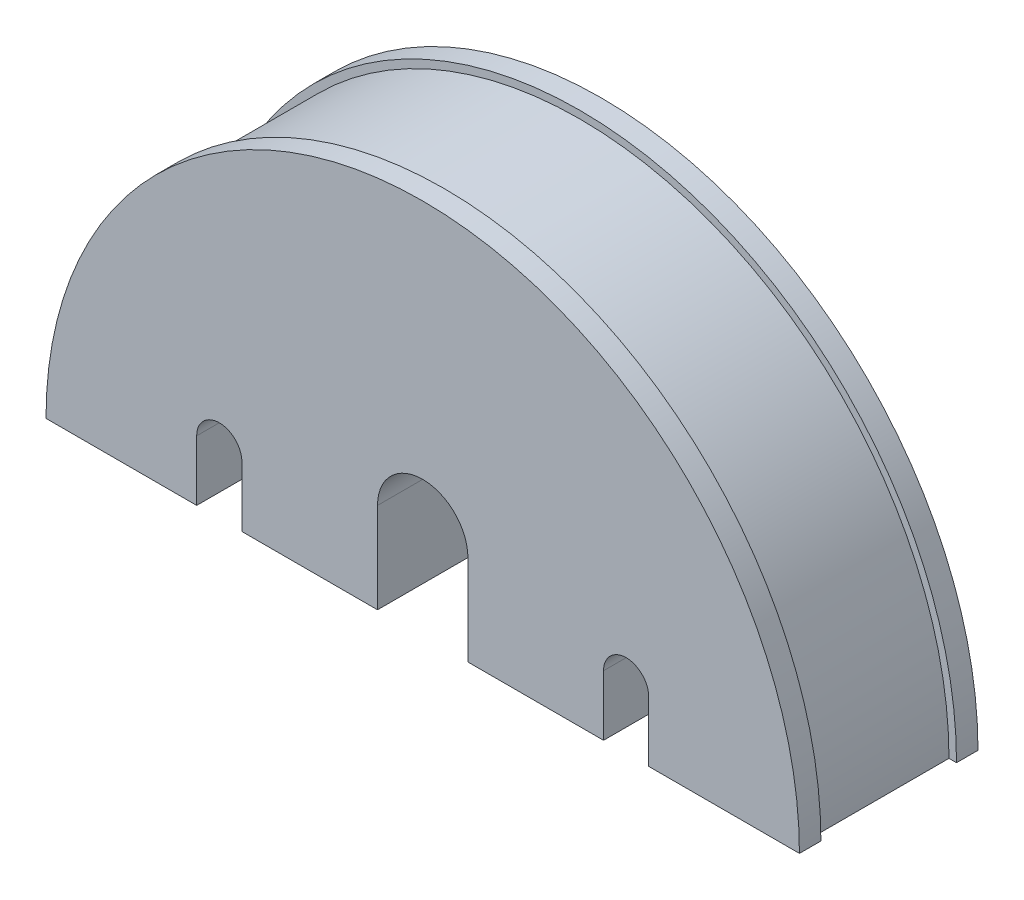
ISO-10303-21;
HEADER;
FILE_DESCRIPTION(('STEP AP214'),'2;1');
FILE_NAME('part.step','',(''),(''),'','','');
FILE_SCHEMA(('AUTOMOTIVE_DESIGN { 1 0 10303 214 1 1 1 1 }'));
ENDSEC;
DATA;
#1=APPLICATION_CONTEXT('core data for automotive mechanical design processes');
#2=APPLICATION_PROTOCOL_DEFINITION('international standard','automotive_design',2000,#1);
#3=PRODUCT_CONTEXT('',#1,'mechanical');
#4=PRODUCT('Part','Part','',(#3));
#5=PRODUCT_RELATED_PRODUCT_CATEGORY('part','',(#4));
#6=PRODUCT_DEFINITION_FORMATION('','',#4);
#7=PRODUCT_DEFINITION_CONTEXT('part definition',#1,'design');
#8=PRODUCT_DEFINITION('design','',#6,#7);
#9=PRODUCT_DEFINITION_SHAPE('','',#8);
#10=(LENGTH_UNIT() NAMED_UNIT(*) SI_UNIT(.MILLI.,.METRE.));
#11=(NAMED_UNIT(*) PLANE_ANGLE_UNIT() SI_UNIT($,.RADIAN.));
#12=(NAMED_UNIT(*) SI_UNIT($,.STERADIAN.) SOLID_ANGLE_UNIT());
#13=UNCERTAINTY_MEASURE_WITH_UNIT(LENGTH_MEASURE(1.E-05),#10,'distance_accuracy_value','');
#14=(GEOMETRIC_REPRESENTATION_CONTEXT(3) GLOBAL_UNCERTAINTY_ASSIGNED_CONTEXT((#13)) GLOBAL_UNIT_ASSIGNED_CONTEXT((#10,
#11,#12)) REPRESENTATION_CONTEXT('',''));
#15=CARTESIAN_POINT('',(0.,0.,0.));
#16=DIRECTION('',(0.,0.,1.));
#17=DIRECTION('',(1.,0.,0.));
#18=AXIS2_PLACEMENT_3D('',#15,#16,#17);
#19=CARTESIAN_POINT('',(0.,0.,118.5));
#20=DIRECTION('',(0.,0.,-1.));
#21=DIRECTION('',(-1.,0.,0.));
#22=AXIS2_PLACEMENT_3D('',#19,#20,#21);
#23=CYLINDRICAL_SURFACE('',#22,500.);
#24=CARTESIAN_POINT('',(0.,0.,-89.9999999999999));
#25=DIRECTION('',(0.,0.,1.));
#26=DIRECTION('',(1.,0.,0.));
#27=AXIS2_PLACEMENT_3D('',#24,#25,#26);
#28=CIRCLE('',#27,500.);
#29=CARTESIAN_POINT('',(500.,0.,-89.9999999999999));
#30=VERTEX_POINT('',#29);
#31=CARTESIAN_POINT('',(-500.,-3.49148133884313E-12,-89.9999999999999));
#32=VERTEX_POINT('',#31);
#33=EDGE_CURVE('E193',#30,#32,#28,.T.);
#34=ORIENTED_EDGE('',*,*,#33,.F.);
#35=DIRECTION('',(0.,0.,-1.));
#36=VECTOR('',#35,1.);
#37=CARTESIAN_POINT('',(500.,0.,118.5));
#38=LINE('',#37,#36);
#39=CARTESIAN_POINT('',(500.,0.,-118.5));
#40=VERTEX_POINT('',#39);
#41=EDGE_CURVE('E115',#30,#40,#38,.T.);
#42=ORIENTED_EDGE('',*,*,#41,.T.);
#43=CARTESIAN_POINT('',(0.,0.,-118.5));
#44=DIRECTION('',(0.,0.,1.));
#45=DIRECTION('',(1.,0.,0.));
#46=AXIS2_PLACEMENT_3D('',#43,#44,#45);
#47=CIRCLE('',#46,500.);
#48=CARTESIAN_POINT('',(-500.,0.,-118.5));
#49=VERTEX_POINT('',#48);
#50=EDGE_CURVE('E189',#40,#49,#47,.T.);
#51=ORIENTED_EDGE('',*,*,#50,.T.);
#52=DIRECTION('',(0.,0.,-1.));
#53=VECTOR('',#52,1.);
#54=CARTESIAN_POINT('',(-500.,0.,118.5));
#55=LINE('',#54,#53);
#56=EDGE_CURVE('E275',#32,#49,#55,.T.);
#57=ORIENTED_EDGE('',*,*,#56,.F.);
#58=EDGE_LOOP('',(#34,#42,#51,#57));
#59=FACE_BOUND('',#58,.T.);
#60=ADVANCED_FACE('F39',(#59),#23,.T.);
#61=CARTESIAN_POINT('',(0.,0.,90.0000000000001));
#62=DIRECTION('',(0.,0.,-1.));
#63=DIRECTION('',(-1.,0.,0.));
#64=AXIS2_PLACEMENT_3D('',#61,#62,#63);
#65=CIRCLE('',#64,500.);
#66=CARTESIAN_POINT('',(-500.,-3.49148133884313E-12,90.0000000000001));
#67=VERTEX_POINT('',#66);
#68=CARTESIAN_POINT('',(500.,0.,90.0000000000001));
#69=VERTEX_POINT('',#68);
#70=EDGE_CURVE('E54',#67,#69,#65,.T.);
#71=ORIENTED_EDGE('',*,*,#70,.F.);
#72=CARTESIAN_POINT('',(-500.,0.,118.5));
#73=VERTEX_POINT('',#72);
#74=EDGE_CURVE('E47',#73,#67,#55,.T.);
#75=ORIENTED_EDGE('',*,*,#74,.F.);
#76=CARTESIAN_POINT('',(0.,0.,118.5));
#77=DIRECTION('',(0.,0.,1.));
#78=DIRECTION('',(1.,0.,0.));
#79=AXIS2_PLACEMENT_3D('',#76,#77,#78);
#80=CIRCLE('',#79,500.);
#81=CARTESIAN_POINT('',(500.,0.,118.5));
#82=VERTEX_POINT('',#81);
#83=EDGE_CURVE('E231',#82,#73,#80,.T.);
#84=ORIENTED_EDGE('',*,*,#83,.F.);
#85=EDGE_CURVE('E232',#82,#69,#38,.T.);
#86=ORIENTED_EDGE('',*,*,#85,.T.);
#87=EDGE_LOOP('',(#71,#75,#84,#86));
#88=FACE_BOUND('',#87,.T.);
#89=ADVANCED_FACE('F297',(#88),#23,.T.);
#90=CARTESIAN_POINT('',(-500.,0.,118.5));
#91=DIRECTION('',(0.,1.,0.));
#92=DIRECTION('',(0.,0.,1.));
#93=AXIS2_PLACEMENT_3D('',#90,#91,#92);
#94=PLANE('',#93);
#95=DIRECTION('',(1.,0.,0.));
#96=VECTOR('',#95,1.);
#97=CARTESIAN_POINT('',(-490.000000000004,-3.4216517120663E-12,-89.9999999999999));
#98=LINE('',#97,#96);
#99=CARTESIAN_POINT('',(-490.000000000004,-3.4216517120663E-12,-89.9999999999999));
#100=VERTEX_POINT('',#99);
#101=EDGE_CURVE('E288',#32,#100,#98,.T.);
#102=ORIENTED_EDGE('',*,*,#101,.F.);
#103=ORIENTED_EDGE('',*,*,#56,.T.);
#104=DIRECTION('',(1.,0.,0.));
#105=VECTOR('',#104,1.);
#106=CARTESIAN_POINT('',(-500.,0.,-118.5));
#107=LINE('',#106,#105);
#108=CARTESIAN_POINT('',(-300.,0.,-118.5));
#109=VERTEX_POINT('',#108);
#110=EDGE_CURVE('E192',#49,#109,#107,.T.);
#111=ORIENTED_EDGE('',*,*,#110,.T.);
#112=DIRECTION('',(0.,0.,-1.));
#113=VECTOR('',#112,1.);
#114=CARTESIAN_POINT('',(-300.,0.,118.5));
#115=LINE('',#114,#113);
#116=CARTESIAN_POINT('',(-300.,0.,118.5));
#117=VERTEX_POINT('',#116);
#118=EDGE_CURVE('E272',#117,#109,#115,.T.);
#119=ORIENTED_EDGE('',*,*,#118,.F.);
#120=DIRECTION('',(1.,0.,0.));
#121=VECTOR('',#120,1.);
#122=CARTESIAN_POINT('',(-500.,0.,118.5));
#123=LINE('',#122,#121);
#124=EDGE_CURVE('E124',#73,#117,#123,.T.);
#125=ORIENTED_EDGE('',*,*,#124,.F.);
#126=ORIENTED_EDGE('',*,*,#74,.T.);
#127=DIRECTION('',(-1.,0.,0.));
#128=VECTOR('',#127,1.);
#129=CARTESIAN_POINT('',(-490.000000000003,-3.4216517120663E-12,90.0000000000001));
#130=LINE('',#129,#128);
#131=CARTESIAN_POINT('',(-490.000000000003,-3.4216517120663E-12,90.0000000000001));
#132=VERTEX_POINT('',#131);
#133=EDGE_CURVE('E560',#132,#67,#130,.T.);
#134=ORIENTED_EDGE('',*,*,#133,.F.);
#135=DIRECTION('',(0.,0.,1.));
#136=VECTOR('',#135,1.);
#137=CARTESIAN_POINT('',(-490.000000000004,-3.4216517120663E-12,-89.9999999999999));
#138=LINE('',#137,#136);
#139=EDGE_CURVE('E556',#100,#132,#138,.T.);
#140=ORIENTED_EDGE('',*,*,#139,.F.);
#141=EDGE_LOOP('',(#102,#103,#111,#119,#125,#126,#134,#140));
#142=FACE_BOUND('',#141,.T.);
#143=ADVANCED_FACE('F284',(#142),#94,.F.);
#144=CARTESIAN_POINT('',(300.,0.,118.5));
#145=DIRECTION('',(0.,1.,0.));
#146=DIRECTION('',(0.,0.,1.));
#147=AXIS2_PLACEMENT_3D('',#144,#145,#146);
#148=PLANE('',#147);
#149=DIRECTION('',(1.,0.,0.));
#150=VECTOR('',#149,1.);
#151=CARTESIAN_POINT('',(300.,0.,-89.9999999999999));
#152=LINE('',#151,#150);
#153=CARTESIAN_POINT('',(490.000000000004,0.,-89.9999999999999));
#154=VERTEX_POINT('',#153);
#155=EDGE_CURVE('E11',#154,#30,#152,.T.);
#156=ORIENTED_EDGE('',*,*,#155,.F.);
#157=DIRECTION('',(0.,0.,1.));
#158=VECTOR('',#157,1.);
#159=CARTESIAN_POINT('',(490.000000000004,0.,-89.9999999999999));
#160=LINE('',#159,#158);
#161=CARTESIAN_POINT('',(490.000000000003,0.,90.0000000000001));
#162=VERTEX_POINT('',#161);
#163=EDGE_CURVE('E555',#154,#162,#160,.T.);
#164=ORIENTED_EDGE('',*,*,#163,.T.);
#165=DIRECTION('',(1.,0.,0.));
#166=VECTOR('',#165,1.);
#167=CARTESIAN_POINT('',(490.000000000003,0.,90.0000000000001));
#168=LINE('',#167,#166);
#169=EDGE_CURVE('E361',#162,#69,#168,.T.);
#170=ORIENTED_EDGE('',*,*,#169,.T.);
#171=ORIENTED_EDGE('',*,*,#85,.F.);
#172=DIRECTION('',(1.,0.,0.));
#173=VECTOR('',#172,1.);
#174=CARTESIAN_POINT('',(300.,0.,118.5));
#175=LINE('',#174,#173);
#176=CARTESIAN_POINT('',(300.,0.,118.5));
#177=VERTEX_POINT('',#176);
#178=EDGE_CURVE('E63',#177,#82,#175,.T.);
#179=ORIENTED_EDGE('',*,*,#178,.F.);
#180=DIRECTION('',(0.,0.,-1.));
#181=VECTOR('',#180,1.);
#182=CARTESIAN_POINT('',(300.,0.,118.5));
#183=LINE('',#182,#181);
#184=CARTESIAN_POINT('',(300.,0.,-118.5));
#185=VERTEX_POINT('',#184);
#186=EDGE_CURVE('E179',#177,#185,#183,.T.);
#187=ORIENTED_EDGE('',*,*,#186,.T.);
#188=DIRECTION('',(1.,0.,0.));
#189=VECTOR('',#188,1.);
#190=CARTESIAN_POINT('',(300.,0.,-118.5));
#191=LINE('',#190,#189);
#192=EDGE_CURVE('E228',#185,#40,#191,.T.);
#193=ORIENTED_EDGE('',*,*,#192,.T.);
#194=ORIENTED_EDGE('',*,*,#41,.F.);
#195=EDGE_LOOP('',(#156,#164,#170,#171,#179,#187,#193,#194));
#196=FACE_BOUND('',#195,.T.);
#197=ADVANCED_FACE('F305',(#196),#148,.F.);
#198=CARTESIAN_POINT('',(-300.,80.,118.5));
#199=DIRECTION('',(-1.,0.,0.));
#200=DIRECTION('',(0.,-1.,0.));
#201=AXIS2_PLACEMENT_3D('',#198,#199,#200);
#202=PLANE('',#201);
#203=DIRECTION('',(0.,1.,0.));
#204=VECTOR('',#203,1.);
#205=CARTESIAN_POINT('',(-300.,80.,-118.5));
#206=LINE('',#205,#204);
#207=CARTESIAN_POINT('',(-300.,80.,-118.5));
#208=VERTEX_POINT('',#207);
#209=EDGE_CURVE('E196',#109,#208,#206,.T.);
#210=ORIENTED_EDGE('',*,*,#209,.T.);
#211=DIRECTION('',(0.,0.,-1.));
#212=VECTOR('',#211,1.);
#213=CARTESIAN_POINT('',(-300.,80.,118.5));
#214=LINE('',#213,#212);
#215=CARTESIAN_POINT('',(-300.,80.,118.5));
#216=VERTEX_POINT('',#215);
#217=EDGE_CURVE('E268',#216,#208,#214,.T.);
#218=ORIENTED_EDGE('',*,*,#217,.F.);
#219=DIRECTION('',(0.,1.,0.));
#220=VECTOR('',#219,1.);
#221=CARTESIAN_POINT('',(-300.,80.,118.5));
#222=LINE('',#221,#220);
#223=EDGE_CURVE('E324',#117,#216,#222,.T.);
#224=ORIENTED_EDGE('',*,*,#223,.F.);
#225=ORIENTED_EDGE('',*,*,#118,.T.);
#226=EDGE_LOOP('',(#210,#218,#224,#225));
#227=FACE_BOUND('',#226,.T.);
#228=ADVANCED_FACE('F365',(#227),#202,.F.);
#229=CARTESIAN_POINT('',(-270.,80.,118.5));
#230=DIRECTION('',(0.,0.,-1.));
#231=DIRECTION('',(-1.,0.,0.));
#232=AXIS2_PLACEMENT_3D('',#229,#230,#231);
#233=CYLINDRICAL_SURFACE('',#232,30.);
#234=CARTESIAN_POINT('',(-270.,80.,-118.5));
#235=DIRECTION('',(0.,0.,-1.));
#236=DIRECTION('',(1.,0.,0.));
#237=AXIS2_PLACEMENT_3D('',#234,#235,#236);
#238=CIRCLE('',#237,30.);
#239=CARTESIAN_POINT('',(-240.,80.,-118.5));
#240=VERTEX_POINT('',#239);
#241=EDGE_CURVE('E199',#208,#240,#238,.T.);
#242=ORIENTED_EDGE('',*,*,#241,.T.);
#243=DIRECTION('',(0.,0.,-1.));
#244=VECTOR('',#243,1.);
#245=CARTESIAN_POINT('',(-240.,80.,118.5));
#246=LINE('',#245,#244);
#247=CARTESIAN_POINT('',(-240.,80.,118.5));
#248=VERTEX_POINT('',#247);
#249=EDGE_CURVE('E264',#248,#240,#246,.T.);
#250=ORIENTED_EDGE('',*,*,#249,.F.);
#251=CARTESIAN_POINT('',(-270.,80.,118.5));
#252=DIRECTION('',(0.,0.,-1.));
#253=DIRECTION('',(1.,0.,0.));
#254=AXIS2_PLACEMENT_3D('',#251,#252,#253);
#255=CIRCLE('',#254,30.);
#256=EDGE_CURVE('E327',#216,#248,#255,.T.);
#257=ORIENTED_EDGE('',*,*,#256,.F.);
#258=ORIENTED_EDGE('',*,*,#217,.T.);
#259=EDGE_LOOP('',(#242,#250,#257,#258));
#260=FACE_BOUND('',#259,.T.);
#261=ADVANCED_FACE('F369',(#260),#233,.F.);
#262=CARTESIAN_POINT('',(-240.,80.,118.5));
#263=DIRECTION('',(1.,0.,0.));
#264=DIRECTION('',(0.,0.,-1.));
#265=AXIS2_PLACEMENT_3D('',#262,#263,#264);
#266=PLANE('',#265);
#267=DIRECTION('',(0.,-1.,0.));
#268=VECTOR('',#267,1.);
#269=CARTESIAN_POINT('',(-240.,80.,-118.5));
#270=LINE('',#269,#268);
#271=CARTESIAN_POINT('',(-240.,0.,-118.5));
#272=VERTEX_POINT('',#271);
#273=EDGE_CURVE('E202',#240,#272,#270,.T.);
#274=ORIENTED_EDGE('',*,*,#273,.T.);
#275=DIRECTION('',(0.,0.,-1.));
#276=VECTOR('',#275,1.);
#277=CARTESIAN_POINT('',(-240.,0.,118.5));
#278=LINE('',#277,#276);
#279=CARTESIAN_POINT('',(-240.,0.,118.5));
#280=VERTEX_POINT('',#279);
#281=EDGE_CURVE('E260',#280,#272,#278,.T.);
#282=ORIENTED_EDGE('',*,*,#281,.F.);
#283=DIRECTION('',(0.,-1.,0.));
#284=VECTOR('',#283,1.);
#285=CARTESIAN_POINT('',(-240.,80.,118.5));
#286=LINE('',#285,#284);
#287=EDGE_CURVE('E330',#248,#280,#286,.T.);
#288=ORIENTED_EDGE('',*,*,#287,.F.);
#289=ORIENTED_EDGE('',*,*,#249,.T.);
#290=EDGE_LOOP('',(#274,#282,#288,#289));
#291=FACE_BOUND('',#290,.T.);
#292=ADVANCED_FACE('F375',(#291),#266,.F.);
#293=CARTESIAN_POINT('',(-240.,0.,118.5));
#294=DIRECTION('',(0.,1.,0.));
#295=DIRECTION('',(-1.,0.,0.));
#296=AXIS2_PLACEMENT_3D('',#293,#294,#295);
#297=PLANE('',#296);
#298=DIRECTION('',(1.,0.,0.));
#299=VECTOR('',#298,1.);
#300=CARTESIAN_POINT('',(-240.,0.,-118.5));
#301=LINE('',#300,#299);
#302=CARTESIAN_POINT('',(-60.,0.,-118.5));
#303=VERTEX_POINT('',#302);
#304=EDGE_CURVE('E205',#272,#303,#301,.T.);
#305=ORIENTED_EDGE('',*,*,#304,.T.);
#306=DIRECTION('',(0.,0.,-1.));
#307=VECTOR('',#306,1.);
#308=CARTESIAN_POINT('',(-60.,0.,118.5));
#309=LINE('',#308,#307);
#310=CARTESIAN_POINT('',(-60.,0.,118.5));
#311=VERTEX_POINT('',#310);
#312=EDGE_CURVE('E256',#311,#303,#309,.T.);
#313=ORIENTED_EDGE('',*,*,#312,.F.);
#314=DIRECTION('',(1.,0.,0.));
#315=VECTOR('',#314,1.);
#316=CARTESIAN_POINT('',(-240.,0.,118.5));
#317=LINE('',#316,#315);
#318=EDGE_CURVE('E333',#280,#311,#317,.T.);
#319=ORIENTED_EDGE('',*,*,#318,.F.);
#320=ORIENTED_EDGE('',*,*,#281,.T.);
#321=EDGE_LOOP('',(#305,#313,#319,#320));
#322=FACE_BOUND('',#321,.T.);
#323=ADVANCED_FACE('F379',(#322),#297,.F.);
#324=CARTESIAN_POINT('',(-60.,120.,118.5));
#325=DIRECTION('',(-1.,0.,0.));
#326=DIRECTION('',(0.,-1.,0.));
#327=AXIS2_PLACEMENT_3D('',#324,#325,#326);
#328=PLANE('',#327);
#329=DIRECTION('',(0.,1.,0.));
#330=VECTOR('',#329,1.);
#331=CARTESIAN_POINT('',(-60.,120.,-118.5));
#332=LINE('',#331,#330);
#333=CARTESIAN_POINT('',(-60.,120.,-118.5));
#334=VERTEX_POINT('',#333);
#335=EDGE_CURVE('E208',#303,#334,#332,.T.);
#336=ORIENTED_EDGE('',*,*,#335,.T.);
#337=DIRECTION('',(0.,0.,-1.));
#338=VECTOR('',#337,1.);
#339=CARTESIAN_POINT('',(-60.,120.,118.5));
#340=LINE('',#339,#338);
#341=CARTESIAN_POINT('',(-60.,120.,118.5));
#342=VERTEX_POINT('',#341);
#343=EDGE_CURVE('E252',#342,#334,#340,.T.);
#344=ORIENTED_EDGE('',*,*,#343,.F.);
#345=DIRECTION('',(0.,1.,0.));
#346=VECTOR('',#345,1.);
#347=CARTESIAN_POINT('',(-60.,120.,118.5));
#348=LINE('',#347,#346);
#349=EDGE_CURVE('E336',#311,#342,#348,.T.);
#350=ORIENTED_EDGE('',*,*,#349,.F.);
#351=ORIENTED_EDGE('',*,*,#312,.T.);
#352=EDGE_LOOP('',(#336,#344,#350,#351));
#353=FACE_BOUND('',#352,.T.);
#354=ADVANCED_FACE('F384',(#353),#328,.F.);
#355=CARTESIAN_POINT('',(0.,120.,118.5));
#356=DIRECTION('',(0.,0.,-1.));
#357=DIRECTION('',(-1.,0.,0.));
#358=AXIS2_PLACEMENT_3D('',#355,#356,#357);
#359=CYLINDRICAL_SURFACE('',#358,60.);
#360=CARTESIAN_POINT('',(0.,120.,-118.5));
#361=DIRECTION('',(0.,0.,-1.));
#362=DIRECTION('',(1.,0.,0.));
#363=AXIS2_PLACEMENT_3D('',#360,#361,#362);
#364=CIRCLE('',#363,60.);
#365=CARTESIAN_POINT('',(60.,120.,-118.5));
#366=VERTEX_POINT('',#365);
#367=EDGE_CURVE('E211',#334,#366,#364,.T.);
#368=ORIENTED_EDGE('',*,*,#367,.T.);
#369=DIRECTION('',(0.,0.,-1.));
#370=VECTOR('',#369,1.);
#371=CARTESIAN_POINT('',(60.,120.,118.5));
#372=LINE('',#371,#370);
#373=CARTESIAN_POINT('',(60.,120.,118.5));
#374=VERTEX_POINT('',#373);
#375=EDGE_CURVE('E248',#374,#366,#372,.T.);
#376=ORIENTED_EDGE('',*,*,#375,.F.);
#377=CARTESIAN_POINT('',(0.,120.,118.5));
#378=DIRECTION('',(0.,0.,-1.));
#379=DIRECTION('',(1.,0.,0.));
#380=AXIS2_PLACEMENT_3D('',#377,#378,#379);
#381=CIRCLE('',#380,60.);
#382=EDGE_CURVE('E339',#342,#374,#381,.T.);
#383=ORIENTED_EDGE('',*,*,#382,.F.);
#384=ORIENTED_EDGE('',*,*,#343,.T.);
#385=EDGE_LOOP('',(#368,#376,#383,#384));
#386=FACE_BOUND('',#385,.T.);
#387=ADVANCED_FACE('F388',(#386),#359,.F.);
#388=CARTESIAN_POINT('',(60.,120.,118.5));
#389=DIRECTION('',(1.,0.,0.));
#390=DIRECTION('',(0.,1.,0.));
#391=AXIS2_PLACEMENT_3D('',#388,#389,#390);
#392=PLANE('',#391);
#393=DIRECTION('',(0.,-1.,0.));
#394=VECTOR('',#393,1.);
#395=CARTESIAN_POINT('',(60.,120.,-118.5));
#396=LINE('',#395,#394);
#397=CARTESIAN_POINT('',(60.,0.,-118.5));
#398=VERTEX_POINT('',#397);
#399=EDGE_CURVE('E214',#366,#398,#396,.T.);
#400=ORIENTED_EDGE('',*,*,#399,.T.);
#401=DIRECTION('',(0.,0.,-1.));
#402=VECTOR('',#401,1.);
#403=CARTESIAN_POINT('',(60.,0.,118.5));
#404=LINE('',#403,#402);
#405=CARTESIAN_POINT('',(60.,0.,118.5));
#406=VERTEX_POINT('',#405);
#407=EDGE_CURVE('E244',#406,#398,#404,.T.);
#408=ORIENTED_EDGE('',*,*,#407,.F.);
#409=DIRECTION('',(0.,-1.,0.));
#410=VECTOR('',#409,1.);
#411=CARTESIAN_POINT('',(60.,120.,118.5));
#412=LINE('',#411,#410);
#413=EDGE_CURVE('E342',#374,#406,#412,.T.);
#414=ORIENTED_EDGE('',*,*,#413,.F.);
#415=ORIENTED_EDGE('',*,*,#375,.T.);
#416=EDGE_LOOP('',(#400,#408,#414,#415));
#417=FACE_BOUND('',#416,.T.);
#418=ADVANCED_FACE('F392',(#417),#392,.F.);
#419=CARTESIAN_POINT('',(60.,0.,118.5));
#420=DIRECTION('',(0.,1.,0.));
#421=DIRECTION('',(-1.,0.,0.));
#422=AXIS2_PLACEMENT_3D('',#419,#420,#421);
#423=PLANE('',#422);
#424=DIRECTION('',(1.,0.,0.));
#425=VECTOR('',#424,1.);
#426=CARTESIAN_POINT('',(60.,0.,-118.5));
#427=LINE('',#426,#425);
#428=CARTESIAN_POINT('',(240.,0.,-118.5));
#429=VERTEX_POINT('',#428);
#430=EDGE_CURVE('E217',#398,#429,#427,.T.);
#431=ORIENTED_EDGE('',*,*,#430,.T.);
#432=DIRECTION('',(0.,0.,-1.));
#433=VECTOR('',#432,1.);
#434=CARTESIAN_POINT('',(240.,0.,118.5));
#435=LINE('',#434,#433);
#436=CARTESIAN_POINT('',(240.,0.,118.5));
#437=VERTEX_POINT('',#436);
#438=EDGE_CURVE('E240',#437,#429,#435,.T.);
#439=ORIENTED_EDGE('',*,*,#438,.F.);
#440=DIRECTION('',(1.,0.,0.));
#441=VECTOR('',#440,1.);
#442=CARTESIAN_POINT('',(60.,0.,118.5));
#443=LINE('',#442,#441);
#444=EDGE_CURVE('E345',#406,#437,#443,.T.);
#445=ORIENTED_EDGE('',*,*,#444,.F.);
#446=ORIENTED_EDGE('',*,*,#407,.T.);
#447=EDGE_LOOP('',(#431,#439,#445,#446));
#448=FACE_BOUND('',#447,.T.);
#449=ADVANCED_FACE('F353',(#448),#423,.F.);
#450=CARTESIAN_POINT('',(240.,80.,118.5));
#451=DIRECTION('',(-1.,0.,0.));
#452=DIRECTION('',(0.,0.,1.));
#453=AXIS2_PLACEMENT_3D('',#450,#451,#452);
#454=PLANE('',#453);
#455=DIRECTION('',(0.,1.,0.));
#456=VECTOR('',#455,1.);
#457=CARTESIAN_POINT('',(240.,80.,-118.5));
#458=LINE('',#457,#456);
#459=CARTESIAN_POINT('',(240.,80.,-118.5));
#460=VERTEX_POINT('',#459);
#461=EDGE_CURVE('E220',#429,#460,#458,.T.);
#462=ORIENTED_EDGE('',*,*,#461,.T.);
#463=DIRECTION('',(0.,0.,-1.));
#464=VECTOR('',#463,1.);
#465=CARTESIAN_POINT('',(240.,80.,118.5));
#466=LINE('',#465,#464);
#467=CARTESIAN_POINT('',(240.,80.,118.5));
#468=VERTEX_POINT('',#467);
#469=EDGE_CURVE('E178',#468,#460,#466,.T.);
#470=ORIENTED_EDGE('',*,*,#469,.F.);
#471=DIRECTION('',(0.,1.,0.));
#472=VECTOR('',#471,1.);
#473=CARTESIAN_POINT('',(240.,80.,118.5));
#474=LINE('',#473,#472);
#475=EDGE_CURVE('E164',#437,#468,#474,.T.);
#476=ORIENTED_EDGE('',*,*,#475,.F.);
#477=ORIENTED_EDGE('',*,*,#438,.T.);
#478=EDGE_LOOP('',(#462,#470,#476,#477));
#479=FACE_BOUND('',#478,.T.);
#480=ADVANCED_FACE('F357',(#479),#454,.F.);
#481=CARTESIAN_POINT('',(270.,80.,118.5));
#482=DIRECTION('',(0.,0.,-1.));
#483=DIRECTION('',(-1.,0.,0.));
#484=AXIS2_PLACEMENT_3D('',#481,#482,#483);
#485=CYLINDRICAL_SURFACE('',#484,30.);
#486=CARTESIAN_POINT('',(270.,80.,-118.5));
#487=DIRECTION('',(0.,0.,-1.));
#488=DIRECTION('',(-1.,0.,0.));
#489=AXIS2_PLACEMENT_3D('',#486,#487,#488);
#490=CIRCLE('',#489,30.);
#491=CARTESIAN_POINT('',(300.,80.,-118.5));
#492=VERTEX_POINT('',#491);
#493=EDGE_CURVE('E174',#460,#492,#490,.T.);
#494=ORIENTED_EDGE('',*,*,#493,.T.);
#495=DIRECTION('',(0.,0.,-1.));
#496=VECTOR('',#495,1.);
#497=CARTESIAN_POINT('',(300.,80.,118.5));
#498=LINE('',#497,#496);
#499=CARTESIAN_POINT('',(300.,80.,118.5));
#500=VERTEX_POINT('',#499);
#501=EDGE_CURVE('E171',#500,#492,#498,.T.);
#502=ORIENTED_EDGE('',*,*,#501,.F.);
#503=CARTESIAN_POINT('',(270.,80.,118.5));
#504=DIRECTION('',(0.,0.,-1.));
#505=DIRECTION('',(-1.,0.,0.));
#506=AXIS2_PLACEMENT_3D('',#503,#504,#505);
#507=CIRCLE('',#506,30.);
#508=EDGE_CURVE('E157',#468,#500,#507,.T.);
#509=ORIENTED_EDGE('',*,*,#508,.F.);
#510=ORIENTED_EDGE('',*,*,#469,.T.);
#511=EDGE_LOOP('',(#494,#502,#509,#510));
#512=FACE_BOUND('',#511,.T.);
#513=ADVANCED_FACE('F172',(#512),#485,.F.);
#514=CARTESIAN_POINT('',(300.,80.,118.5));
#515=DIRECTION('',(1.,0.,0.));
#516=DIRECTION('',(0.,1.,0.));
#517=AXIS2_PLACEMENT_3D('',#514,#515,#516);
#518=PLANE('',#517);
#519=DIRECTION('',(0.,-1.,0.));
#520=VECTOR('',#519,1.);
#521=CARTESIAN_POINT('',(300.,80.,-118.5));
#522=LINE('',#521,#520);
#523=EDGE_CURVE('E225',#492,#185,#522,.T.);
#524=ORIENTED_EDGE('',*,*,#523,.T.);
#525=ORIENTED_EDGE('',*,*,#186,.F.);
#526=DIRECTION('',(0.,-1.,0.));
#527=VECTOR('',#526,1.);
#528=CARTESIAN_POINT('',(300.,80.,118.5));
#529=LINE('',#528,#527);
#530=EDGE_CURVE('E161',#500,#177,#529,.T.);
#531=ORIENTED_EDGE('',*,*,#530,.F.);
#532=ORIENTED_EDGE('',*,*,#501,.T.);
#533=EDGE_LOOP('',(#524,#525,#531,#532));
#534=FACE_BOUND('',#533,.T.);
#535=ADVANCED_FACE('F181',(#534),#518,.F.);
#536=CARTESIAN_POINT('',(0.,0.,118.5));
#537=DIRECTION('',(0.,0.,1.));
#538=DIRECTION('',(1.,0.,0.));
#539=AXIS2_PLACEMENT_3D('',#536,#537,#538);
#540=PLANE('',#539);
#541=ORIENTED_EDGE('',*,*,#83,.T.);
#542=ORIENTED_EDGE('',*,*,#124,.T.);
#543=ORIENTED_EDGE('',*,*,#223,.T.);
#544=ORIENTED_EDGE('',*,*,#256,.T.);
#545=ORIENTED_EDGE('',*,*,#287,.T.);
#546=ORIENTED_EDGE('',*,*,#318,.T.);
#547=ORIENTED_EDGE('',*,*,#349,.T.);
#548=ORIENTED_EDGE('',*,*,#382,.T.);
#549=ORIENTED_EDGE('',*,*,#413,.T.);
#550=ORIENTED_EDGE('',*,*,#444,.T.);
#551=ORIENTED_EDGE('',*,*,#475,.T.);
#552=ORIENTED_EDGE('',*,*,#508,.T.);
#553=ORIENTED_EDGE('',*,*,#530,.T.);
#554=ORIENTED_EDGE('',*,*,#178,.T.);
#555=EDGE_LOOP('',(#541,#542,#543,#544,#545,#546,#547,#548,#549,#550,#551,#552,#553,#554));
#556=FACE_BOUND('',#555,.T.);
#557=ADVANCED_FACE('F159',(#556),#540,.T.);
#558=CARTESIAN_POINT('',(0.,0.,-118.5));
#559=DIRECTION('',(0.,0.,1.));
#560=DIRECTION('',(1.,0.,0.));
#561=AXIS2_PLACEMENT_3D('',#558,#559,#560);
#562=PLANE('',#561);
#563=ORIENTED_EDGE('',*,*,#50,.F.);
#564=ORIENTED_EDGE('',*,*,#192,.F.);
#565=ORIENTED_EDGE('',*,*,#523,.F.);
#566=ORIENTED_EDGE('',*,*,#493,.F.);
#567=ORIENTED_EDGE('',*,*,#461,.F.);
#568=ORIENTED_EDGE('',*,*,#430,.F.);
#569=ORIENTED_EDGE('',*,*,#399,.F.);
#570=ORIENTED_EDGE('',*,*,#367,.F.);
#571=ORIENTED_EDGE('',*,*,#335,.F.);
#572=ORIENTED_EDGE('',*,*,#304,.F.);
#573=ORIENTED_EDGE('',*,*,#273,.F.);
#574=ORIENTED_EDGE('',*,*,#241,.F.);
#575=ORIENTED_EDGE('',*,*,#209,.F.);
#576=ORIENTED_EDGE('',*,*,#110,.F.);
#577=EDGE_LOOP('',(#563,#564,#565,#566,#567,#568,#569,#570,#571,#572,#573,#574,#575,#576));
#578=FACE_BOUND('',#577,.T.);
#579=ADVANCED_FACE('F292',(#578),#562,.F.);
#580=CARTESIAN_POINT('',(-490.000000000004,-3.4216517120663E-12,-89.9999999999999));
#581=DIRECTION('',(0.,0.,1.));
#582=DIRECTION('',(1.,0.,0.));
#583=AXIS2_PLACEMENT_3D('',#580,#581,#582);
#584=PLANE('',#583);
#585=ORIENTED_EDGE('',*,*,#33,.T.);
#586=ORIENTED_EDGE('',*,*,#101,.T.);
#587=CARTESIAN_POINT('',(0.,0.,-89.9999999999999));
#588=DIRECTION('',(0.,0.,-1.));
#589=DIRECTION('',(-1.,0.,0.));
#590=AXIS2_PLACEMENT_3D('',#587,#588,#589);
#591=CIRCLE('',#590,490.000000000004);
#592=EDGE_CURVE('E310',#100,#154,#591,.T.);
#593=ORIENTED_EDGE('',*,*,#592,.T.);
#594=ORIENTED_EDGE('',*,*,#155,.T.);
#595=EDGE_LOOP('',(#585,#586,#593,#594));
#596=FACE_BOUND('',#595,.T.);
#597=ADVANCED_FACE('F448',(#596),#584,.T.);
#598=CARTESIAN_POINT('',(-490.000000000003,-3.4216517120663E-12,90.0000000000001));
#599=DIRECTION('',(0.,0.,-1.));
#600=DIRECTION('',(-1.,0.,0.));
#601=AXIS2_PLACEMENT_3D('',#598,#599,#600);
#602=PLANE('',#601);
#603=ORIENTED_EDGE('',*,*,#70,.T.);
#604=ORIENTED_EDGE('',*,*,#169,.F.);
#605=CARTESIAN_POINT('',(0.,0.,90.0000000000001));
#606=DIRECTION('',(0.,0.,-1.));
#607=DIRECTION('',(-1.,0.,0.));
#608=AXIS2_PLACEMENT_3D('',#605,#606,#607);
#609=CIRCLE('',#608,490.000000000003);
#610=EDGE_CURVE('E316',#132,#162,#609,.T.);
#611=ORIENTED_EDGE('',*,*,#610,.F.);
#612=ORIENTED_EDGE('',*,*,#133,.T.);
#613=EDGE_LOOP('',(#603,#604,#611,#612));
#614=FACE_BOUND('',#613,.T.);
#615=ADVANCED_FACE('F454',(#614),#602,.T.);
#616=CARTESIAN_POINT('',(0.,0.,-254.401615847937));
#617=DIRECTION('',(0.,0.,-1.));
#618=DIRECTION('',(-1.,0.,0.));
#619=AXIS2_PLACEMENT_3D('',#616,#617,#618);
#620=CYLINDRICAL_SURFACE('',#619,490.000000000004);
#621=ORIENTED_EDGE('',*,*,#610,.T.);
#622=ORIENTED_EDGE('',*,*,#163,.F.);
#623=ORIENTED_EDGE('',*,*,#592,.F.);
#624=ORIENTED_EDGE('',*,*,#139,.T.);
#625=EDGE_LOOP('',(#621,#622,#623,#624));
#626=FACE_BOUND('',#625,.T.);
#627=ADVANCED_FACE('F462',(#626),#620,.T.);
#628=CLOSED_SHELL('',(#60,#89,#143,#197,#228,#261,#292,#323,#354,#387,#418,#449,#480,#513,#535,
#557,#579,#597,#615,#627));
#629=MANIFOLD_SOLID_BREP('B2',#628);
#630=ADVANCED_BREP_SHAPE_REPRESENTATION('',(#18,#629),#14);
#631=SHAPE_DEFINITION_REPRESENTATION(#9,#630);
ENDSEC;
END-ISO-10303-21;
